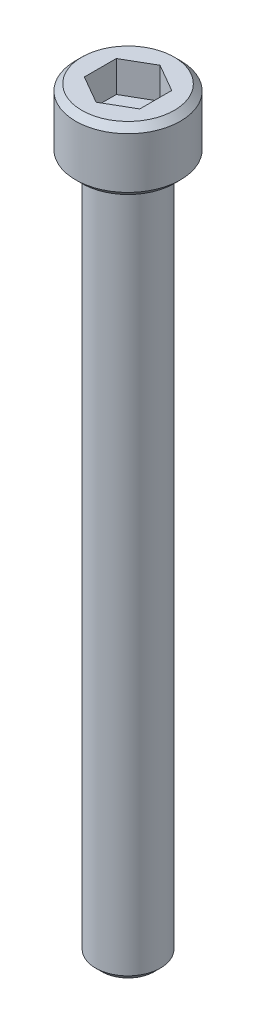
ISO-10303-21;
HEADER;
FILE_DESCRIPTION(('STEP AP214'),'2;1');
FILE_NAME('part.step','',(''),(''),'','','');
FILE_SCHEMA(('AUTOMOTIVE_DESIGN { 1 0 10303 214 1 1 1 1 }'));
ENDSEC;
DATA;
#1=APPLICATION_CONTEXT('core data for automotive mechanical design processes');
#2=APPLICATION_PROTOCOL_DEFINITION('international standard','automotive_design',2000,#1);
#3=PRODUCT_CONTEXT('',#1,'mechanical');
#4=PRODUCT('Part','Part','',(#3));
#5=PRODUCT_RELATED_PRODUCT_CATEGORY('part','',(#4));
#6=PRODUCT_DEFINITION_FORMATION('','',#4);
#7=PRODUCT_DEFINITION_CONTEXT('part definition',#1,'design');
#8=PRODUCT_DEFINITION('design','',#6,#7);
#9=PRODUCT_DEFINITION_SHAPE('','',#8);
#10=(LENGTH_UNIT() NAMED_UNIT(*) SI_UNIT(.MILLI.,.METRE.));
#11=(NAMED_UNIT(*) PLANE_ANGLE_UNIT() SI_UNIT($,.RADIAN.));
#12=(NAMED_UNIT(*) SI_UNIT($,.STERADIAN.) SOLID_ANGLE_UNIT());
#13=UNCERTAINTY_MEASURE_WITH_UNIT(LENGTH_MEASURE(1.E-05),#10,'distance_accuracy_value','');
#14=(GEOMETRIC_REPRESENTATION_CONTEXT(3) GLOBAL_UNCERTAINTY_ASSIGNED_CONTEXT((#13)) GLOBAL_UNIT_ASSIGNED_CONTEXT((#10,
#11,#12)) REPRESENTATION_CONTEXT('',''));
#15=CARTESIAN_POINT('',(0.,0.,0.));
#16=DIRECTION('',(0.,0.,1.));
#17=DIRECTION('',(1.,0.,0.));
#18=AXIS2_PLACEMENT_3D('',#15,#16,#17);
#19=CARTESIAN_POINT('',(0.,4.064,0.));
#20=DIRECTION('',(0.,-1.,0.));
#21=DIRECTION('',(0.,0.,-1.));
#22=AXIS2_PLACEMENT_3D('',#19,#20,#21);
#23=CYLINDRICAL_SURFACE('',#22,3.3655);
#24=CARTESIAN_POINT('',(0.,3.66400000004357,0.));
#25=DIRECTION('',(0.,1.,0.));
#26=DIRECTION('',(0.,0.,1.));
#27=AXIS2_PLACEMENT_3D('',#24,#25,#26);
#28=CIRCLE('',#27,3.3655);
#29=CARTESIAN_POINT('',(0.,3.66400000004357,3.3655));
#30=VERTEX_POINT('',#29);
#31=EDGE_CURVE('E146',#30,#30,#28,.F.);
#32=ORIENTED_EDGE('',*,*,#31,.T.);
#33=EDGE_LOOP('',(#32));
#34=FACE_BOUND('',#33,.T.);
#35=CARTESIAN_POINT('',(0.,0.399999999956436,0.));
#36=DIRECTION('',(0.,-1.,0.));
#37=DIRECTION('',(0.,0.,-1.));
#38=AXIS2_PLACEMENT_3D('',#35,#36,#37);
#39=CIRCLE('',#38,3.3655);
#40=CARTESIAN_POINT('',(0.,0.399999999956436,-3.3655));
#41=VERTEX_POINT('',#40);
#42=EDGE_CURVE('E143',#41,#41,#39,.F.);
#43=ORIENTED_EDGE('',*,*,#42,.T.);
#44=EDGE_LOOP('',(#43));
#45=FACE_BOUND('',#44,.T.);
#46=ADVANCED_FACE('F33',(#34,#45),#23,.T.);
#47=CARTESIAN_POINT('',(3.3655,4.064,0.));
#48=DIRECTION('',(0.,1.,0.));
#49=DIRECTION('',(0.,0.,1.));
#50=AXIS2_PLACEMENT_3D('',#47,#48,#49);
#51=PLANE('',#50);
#52=CARTESIAN_POINT('',(0.,4.064,0.));
#53=DIRECTION('',(0.,1.,0.));
#54=DIRECTION('',(0.,0.,1.));
#55=AXIS2_PLACEMENT_3D('',#52,#53,#54);
#56=CIRCLE('',#55,2.96550000004358);
#57=CARTESIAN_POINT('',(0.,4.064,2.96550000004358));
#58=VERTEX_POINT('',#57);
#59=EDGE_CURVE('E149',#58,#58,#56,.T.);
#60=ORIENTED_EDGE('',*,*,#59,.T.);
#61=EDGE_LOOP('',(#60));
#62=FACE_BOUND('',#61,.T.);
#63=DIRECTION('',(0.,0.,-1.));
#64=VECTOR('',#63,1.);
#65=CARTESIAN_POINT('',(1.778,4.064,1.02652877861915));
#66=LINE('',#65,#64);
#67=CARTESIAN_POINT('',(1.778,4.064,1.02652877861915));
#68=VERTEX_POINT('',#67);
#69=CARTESIAN_POINT('',(1.778,4.064,-1.02652877861916));
#70=VERTEX_POINT('',#69);
#71=EDGE_CURVE('E48',#68,#70,#66,.T.);
#72=ORIENTED_EDGE('',*,*,#71,.F.);
#73=DIRECTION('',(0.866025403784438,0.,-0.500000000000001));
#74=VECTOR('',#73,1.);
#75=CARTESIAN_POINT('',(0.,4.064,2.05305755723831));
#76=LINE('',#75,#74);
#77=CARTESIAN_POINT('',(0.,4.064,2.05305755723831));
#78=VERTEX_POINT('',#77);
#79=EDGE_CURVE('E131',#78,#68,#76,.T.);
#80=ORIENTED_EDGE('',*,*,#79,.F.);
#81=DIRECTION('',(0.866025403784439,0.,0.5));
#82=VECTOR('',#81,1.);
#83=CARTESIAN_POINT('',(-1.778,4.064,1.02652877861916));
#84=LINE('',#83,#82);
#85=CARTESIAN_POINT('',(-1.778,4.064,1.02652877861916));
#86=VERTEX_POINT('',#85);
#87=EDGE_CURVE('E129',#86,#78,#84,.T.);
#88=ORIENTED_EDGE('',*,*,#87,.F.);
#89=DIRECTION('',(0.,0.,1.));
#90=VECTOR('',#89,1.);
#91=CARTESIAN_POINT('',(-1.778,4.064,-1.02652877861915));
#92=LINE('',#91,#90);
#93=CARTESIAN_POINT('',(-1.778,4.064,-1.02652877861915));
#94=VERTEX_POINT('',#93);
#95=EDGE_CURVE('E96',#94,#86,#92,.T.);
#96=ORIENTED_EDGE('',*,*,#95,.F.);
#97=DIRECTION('',(-0.866025403784438,0.,0.5));
#98=VECTOR('',#97,1.);
#99=CARTESIAN_POINT('',(0.,4.064,-2.05305755723831));
#100=LINE('',#99,#98);
#101=CARTESIAN_POINT('',(0.,4.064,-2.05305755723831));
#102=VERTEX_POINT('',#101);
#103=EDGE_CURVE('E125',#102,#94,#100,.T.);
#104=ORIENTED_EDGE('',*,*,#103,.F.);
#105=DIRECTION('',(-0.866025403784439,0.,-0.499999999999999));
#106=VECTOR('',#105,1.);
#107=CARTESIAN_POINT('',(1.778,4.064,-1.02652877861916));
#108=LINE('',#107,#106);
#109=EDGE_CURVE('E122',#70,#102,#108,.T.);
#110=ORIENTED_EDGE('',*,*,#109,.F.);
#111=EDGE_LOOP('',(#72,#80,#88,#96,#104,#110));
#112=FACE_BOUND('',#111,.T.);
#113=ADVANCED_FACE('F179',(#62,#112),#51,.T.);
#114=CARTESIAN_POINT('',(0.,0.,0.));
#115=DIRECTION('',(0.,-1.,0.));
#116=DIRECTION('',(0.,0.,-1.));
#117=AXIS2_PLACEMENT_3D('',#114,#115,#116);
#118=PLANE('',#117);
#119=CARTESIAN_POINT('',(0.,0.,0.));
#120=DIRECTION('',(0.,-1.,0.));
#121=DIRECTION('',(0.,0.,-1.));
#122=AXIS2_PLACEMENT_3D('',#119,#120,#121);
#123=CIRCLE('',#122,2.96550000004356);
#124=CARTESIAN_POINT('',(0.,0.,-2.96550000004356));
#125=VERTEX_POINT('',#124);
#126=EDGE_CURVE('E11',#125,#125,#123,.T.);
#127=ORIENTED_EDGE('',*,*,#126,.T.);
#128=EDGE_LOOP('',(#127));
#129=FACE_BOUND('',#128,.T.);
#130=CARTESIAN_POINT('',(0.,0.,0.));
#131=DIRECTION('',(0.,-1.,0.));
#132=DIRECTION('',(0.,0.,-1.));
#133=AXIS2_PLACEMENT_3D('',#130,#131,#132);
#134=CIRCLE('',#133,2.0828);
#135=CARTESIAN_POINT('',(0.,0.,-2.0828));
#136=VERTEX_POINT('',#135);
#137=EDGE_CURVE('E135',#136,#136,#134,.T.);
#138=ORIENTED_EDGE('',*,*,#137,.F.);
#139=EDGE_LOOP('',(#138));
#140=FACE_BOUND('',#139,.T.);
#141=ADVANCED_FACE('F176',(#129,#140),#118,.T.);
#142=CARTESIAN_POINT('',(0.,-44.45,0.));
#143=DIRECTION('',(0.,1.,0.));
#144=DIRECTION('',(0.,0.,1.));
#145=AXIS2_PLACEMENT_3D('',#142,#143,#144);
#146=CYLINDRICAL_SURFACE('',#145,2.0828);
#147=CARTESIAN_POINT('',(0.,-44.0500000000436,0.));
#148=DIRECTION('',(0.,-1.,0.));
#149=DIRECTION('',(0.,0.,-1.));
#150=AXIS2_PLACEMENT_3D('',#147,#148,#149);
#151=CIRCLE('',#150,2.0828);
#152=CARTESIAN_POINT('',(0.,-44.0500000000436,-2.0828));
#153=VERTEX_POINT('',#152);
#154=EDGE_CURVE('E41',#153,#153,#151,.F.);
#155=ORIENTED_EDGE('',*,*,#154,.T.);
#156=EDGE_LOOP('',(#155));
#157=FACE_BOUND('',#156,.T.);
#158=ORIENTED_EDGE('',*,*,#137,.T.);
#159=EDGE_LOOP('',(#158));
#160=FACE_BOUND('',#159,.T.);
#161=ADVANCED_FACE('F157',(#157,#160),#146,.T.);
#162=CARTESIAN_POINT('',(0.,-44.45,0.));
#163=DIRECTION('',(0.,-1.,0.));
#164=DIRECTION('',(0.,0.,-1.));
#165=AXIS2_PLACEMENT_3D('',#162,#163,#164);
#166=PLANE('',#165);
#167=CARTESIAN_POINT('',(0.,-44.45,0.));
#168=DIRECTION('',(0.,-1.,0.));
#169=DIRECTION('',(0.,0.,-1.));
#170=AXIS2_PLACEMENT_3D('',#167,#168,#169);
#171=CIRCLE('',#170,1.68280000004357);
#172=CARTESIAN_POINT('',(0.,-44.45,-1.68280000004357));
#173=VERTEX_POINT('',#172);
#174=EDGE_CURVE('E152',#173,#173,#171,.T.);
#175=ORIENTED_EDGE('',*,*,#174,.T.);
#176=EDGE_LOOP('',(#175));
#177=FACE_BOUND('',#176,.T.);
#178=ADVANCED_FACE('F166',(#177),#166,.T.);
#179=CARTESIAN_POINT('',(1.778,2.064,1.02652877861915));
#180=DIRECTION('',(1.,0.,0.));
#181=DIRECTION('',(0.,0.,-1.));
#182=AXIS2_PLACEMENT_3D('',#179,#180,#181);
#183=PLANE('',#182);
#184=ORIENTED_EDGE('',*,*,#71,.T.);
#185=DIRECTION('',(0.,1.,0.));
#186=VECTOR('',#185,1.);
#187=CARTESIAN_POINT('',(1.778,2.064,-1.02652877861916));
#188=LINE('',#187,#186);
#189=CARTESIAN_POINT('',(1.778,2.064,-1.02652877861916));
#190=VERTEX_POINT('',#189);
#191=EDGE_CURVE('E78',#190,#70,#188,.T.);
#192=ORIENTED_EDGE('',*,*,#191,.F.);
#193=DIRECTION('',(0.,0.,-1.));
#194=VECTOR('',#193,1.);
#195=CARTESIAN_POINT('',(1.778,2.064,1.02652877861915));
#196=LINE('',#195,#194);
#197=CARTESIAN_POINT('',(1.778,2.064,1.02652877861915));
#198=VERTEX_POINT('',#197);
#199=EDGE_CURVE('E133',#198,#190,#196,.T.);
#200=ORIENTED_EDGE('',*,*,#199,.F.);
#201=DIRECTION('',(0.,1.,0.));
#202=VECTOR('',#201,1.);
#203=CARTESIAN_POINT('',(1.778,2.064,1.02652877861915));
#204=LINE('',#203,#202);
#205=EDGE_CURVE('E56',#198,#68,#204,.T.);
#206=ORIENTED_EDGE('',*,*,#205,.T.);
#207=EDGE_LOOP('',(#184,#192,#200,#206));
#208=FACE_BOUND('',#207,.T.);
#209=ADVANCED_FACE('F168',(#208),#183,.F.);
#210=CARTESIAN_POINT('',(0.,2.064,2.05305755723831));
#211=DIRECTION('',(0.500000000000001,0.,0.866025403784438));
#212=DIRECTION('',(0.866025403784438,0.,-0.500000000000001));
#213=AXIS2_PLACEMENT_3D('',#210,#211,#212);
#214=PLANE('',#213);
#215=ORIENTED_EDGE('',*,*,#79,.T.);
#216=ORIENTED_EDGE('',*,*,#205,.F.);
#217=DIRECTION('',(0.866025403784438,0.,-0.500000000000001));
#218=VECTOR('',#217,1.);
#219=CARTESIAN_POINT('',(0.,2.064,2.05305755723831));
#220=LINE('',#219,#218);
#221=CARTESIAN_POINT('',(0.,2.064,2.05305755723831));
#222=VERTEX_POINT('',#221);
#223=EDGE_CURVE('E108',#222,#198,#220,.T.);
#224=ORIENTED_EDGE('',*,*,#223,.F.);
#225=DIRECTION('',(0.,1.,0.));
#226=VECTOR('',#225,1.);
#227=CARTESIAN_POINT('',(0.,2.064,2.05305755723831));
#228=LINE('',#227,#226);
#229=EDGE_CURVE('E100',#222,#78,#228,.T.);
#230=ORIENTED_EDGE('',*,*,#229,.T.);
#231=EDGE_LOOP('',(#215,#216,#224,#230));
#232=FACE_BOUND('',#231,.T.);
#233=ADVANCED_FACE('F174',(#232),#214,.F.);
#234=CARTESIAN_POINT('',(-1.778,2.064,1.02652877861916));
#235=DIRECTION('',(-0.5,0.,0.866025403784439));
#236=DIRECTION('',(0.866025403784439,0.,0.5));
#237=AXIS2_PLACEMENT_3D('',#234,#235,#236);
#238=PLANE('',#237);
#239=ORIENTED_EDGE('',*,*,#87,.T.);
#240=ORIENTED_EDGE('',*,*,#229,.F.);
#241=DIRECTION('',(0.866025403784439,0.,0.5));
#242=VECTOR('',#241,1.);
#243=CARTESIAN_POINT('',(-1.778,2.064,1.02652877861916));
#244=LINE('',#243,#242);
#245=CARTESIAN_POINT('',(-1.778,2.064,1.02652877861916));
#246=VERTEX_POINT('',#245);
#247=EDGE_CURVE('E104',#246,#222,#244,.T.);
#248=ORIENTED_EDGE('',*,*,#247,.F.);
#249=DIRECTION('',(0.,1.,0.));
#250=VECTOR('',#249,1.);
#251=CARTESIAN_POINT('',(-1.778,2.064,1.02652877861916));
#252=LINE('',#251,#250);
#253=EDGE_CURVE('E89',#246,#86,#252,.T.);
#254=ORIENTED_EDGE('',*,*,#253,.T.);
#255=EDGE_LOOP('',(#239,#240,#248,#254));
#256=FACE_BOUND('',#255,.T.);
#257=ADVANCED_FACE('F105',(#256),#238,.F.);
#258=CARTESIAN_POINT('',(-1.778,2.064,-1.02652877861915));
#259=DIRECTION('',(-1.,0.,0.));
#260=DIRECTION('',(0.,0.,1.));
#261=AXIS2_PLACEMENT_3D('',#258,#259,#260);
#262=PLANE('',#261);
#263=ORIENTED_EDGE('',*,*,#95,.T.);
#264=ORIENTED_EDGE('',*,*,#253,.F.);
#265=DIRECTION('',(0.,0.,1.));
#266=VECTOR('',#265,1.);
#267=CARTESIAN_POINT('',(-1.778,2.064,-1.02652877861915));
#268=LINE('',#267,#266);
#269=CARTESIAN_POINT('',(-1.778,2.064,-1.02652877861915));
#270=VERTEX_POINT('',#269);
#271=EDGE_CURVE('E93',#270,#246,#268,.T.);
#272=ORIENTED_EDGE('',*,*,#271,.F.);
#273=DIRECTION('',(0.,1.,0.));
#274=VECTOR('',#273,1.);
#275=CARTESIAN_POINT('',(-1.778,2.064,-1.02652877861915));
#276=LINE('',#275,#274);
#277=EDGE_CURVE('E101',#270,#94,#276,.T.);
#278=ORIENTED_EDGE('',*,*,#277,.T.);
#279=EDGE_LOOP('',(#263,#264,#272,#278));
#280=FACE_BOUND('',#279,.T.);
#281=ADVANCED_FACE('F91',(#280),#262,.F.);
#282=CARTESIAN_POINT('',(0.,2.064,-2.05305755723831));
#283=DIRECTION('',(-0.5,0.,-0.866025403784439));
#284=DIRECTION('',(-0.866025403784439,0.,0.5));
#285=AXIS2_PLACEMENT_3D('',#282,#283,#284);
#286=PLANE('',#285);
#287=ORIENTED_EDGE('',*,*,#103,.T.);
#288=ORIENTED_EDGE('',*,*,#277,.F.);
#289=DIRECTION('',(-0.866025403784438,0.,0.5));
#290=VECTOR('',#289,1.);
#291=CARTESIAN_POINT('',(0.,2.064,-2.05305755723831));
#292=LINE('',#291,#290);
#293=CARTESIAN_POINT('',(0.,2.064,-2.05305755723831));
#294=VERTEX_POINT('',#293);
#295=EDGE_CURVE('E114',#294,#270,#292,.T.);
#296=ORIENTED_EDGE('',*,*,#295,.F.);
#297=DIRECTION('',(0.,1.,0.));
#298=VECTOR('',#297,1.);
#299=CARTESIAN_POINT('',(0.,2.064,-2.05305755723831));
#300=LINE('',#299,#298);
#301=EDGE_CURVE('E138',#294,#102,#300,.T.);
#302=ORIENTED_EDGE('',*,*,#301,.T.);
#303=EDGE_LOOP('',(#287,#288,#296,#302));
#304=FACE_BOUND('',#303,.T.);
#305=ADVANCED_FACE('F215',(#304),#286,.F.);
#306=CARTESIAN_POINT('',(1.778,2.064,-1.02652877861916));
#307=DIRECTION('',(0.499999999999999,0.,-0.866025403784439));
#308=DIRECTION('',(-0.866025403784439,0.,-0.499999999999999));
#309=AXIS2_PLACEMENT_3D('',#306,#307,#308);
#310=PLANE('',#309);
#311=ORIENTED_EDGE('',*,*,#109,.T.);
#312=ORIENTED_EDGE('',*,*,#301,.F.);
#313=DIRECTION('',(-0.866025403784439,0.,-0.499999999999999));
#314=VECTOR('',#313,1.);
#315=CARTESIAN_POINT('',(1.778,2.064,-1.02652877861916));
#316=LINE('',#315,#314);
#317=EDGE_CURVE('E116',#190,#294,#316,.T.);
#318=ORIENTED_EDGE('',*,*,#317,.F.);
#319=ORIENTED_EDGE('',*,*,#191,.T.);
#320=EDGE_LOOP('',(#311,#312,#318,#319));
#321=FACE_BOUND('',#320,.T.);
#322=ADVANCED_FACE('F195',(#321),#310,.F.);
#323=CARTESIAN_POINT('',(0.,2.064,0.));
#324=DIRECTION('',(0.,1.,0.));
#325=DIRECTION('',(0.,0.,1.));
#326=AXIS2_PLACEMENT_3D('',#323,#324,#325);
#327=PLANE('',#326);
#328=ORIENTED_EDGE('',*,*,#199,.T.);
#329=ORIENTED_EDGE('',*,*,#317,.T.);
#330=ORIENTED_EDGE('',*,*,#295,.T.);
#331=ORIENTED_EDGE('',*,*,#271,.T.);
#332=ORIENTED_EDGE('',*,*,#247,.T.);
#333=ORIENTED_EDGE('',*,*,#223,.T.);
#334=EDGE_LOOP('',(#328,#329,#330,#331,#332,#333));
#335=FACE_BOUND('',#334,.T.);
#336=ADVANCED_FACE('F111',(#335),#327,.T.);
#337=CARTESIAN_POINT('',(0.,3.66400000004357,0.));
#338=DIRECTION('',(0.,-1.,0.));
#339=DIRECTION('',(0.,0.,-1.));
#340=AXIS2_PLACEMENT_3D('',#337,#338,#339);
#341=CONICAL_SURFACE('',#340,3.3655,0.785398163397441);
#342=ORIENTED_EDGE('',*,*,#59,.F.);
#343=EDGE_LOOP('',(#342));
#344=FACE_BOUND('',#343,.T.);
#345=ORIENTED_EDGE('',*,*,#31,.F.);
#346=EDGE_LOOP('',(#345));
#347=FACE_BOUND('',#346,.T.);
#348=ADVANCED_FACE('F163',(#344,#347),#341,.T.);
#349=CARTESIAN_POINT('',(0.,-44.45,0.));
#350=DIRECTION('',(0.,1.,0.));
#351=DIRECTION('',(0.,0.,1.));
#352=AXIS2_PLACEMENT_3D('',#349,#350,#351);
#353=CONICAL_SURFACE('',#352,1.68280000004357,0.785398163397436);
#354=ORIENTED_EDGE('',*,*,#154,.F.);
#355=EDGE_LOOP('',(#354));
#356=FACE_BOUND('',#355,.T.);
#357=ORIENTED_EDGE('',*,*,#174,.F.);
#358=EDGE_LOOP('',(#357));
#359=FACE_BOUND('',#358,.T.);
#360=ADVANCED_FACE('F160',(#356,#359),#353,.T.);
#361=CARTESIAN_POINT('',(0.,0.,0.));
#362=DIRECTION('',(0.,1.,0.));
#363=DIRECTION('',(0.,0.,1.));
#364=AXIS2_PLACEMENT_3D('',#361,#362,#363);
#365=CONICAL_SURFACE('',#364,2.96550000004356,0.785398163397447);
#366=ORIENTED_EDGE('',*,*,#42,.F.);
#367=EDGE_LOOP('',(#366));
#368=FACE_BOUND('',#367,.T.);
#369=ORIENTED_EDGE('',*,*,#126,.F.);
#370=EDGE_LOOP('',(#369));
#371=FACE_BOUND('',#370,.T.);
#372=ADVANCED_FACE('F35',(#368,#371),#365,.T.);
#373=CLOSED_SHELL('',(#46,#113,#141,#161,#178,#209,#233,#257,#281,#305,#322,#336,#348,#360,#372));
#374=MANIFOLD_SOLID_BREP('B2',#373);
#375=ADVANCED_BREP_SHAPE_REPRESENTATION('',(#18,#374),#14);
#376=SHAPE_DEFINITION_REPRESENTATION(#9,#375);
ENDSEC;
END-ISO-10303-21;
